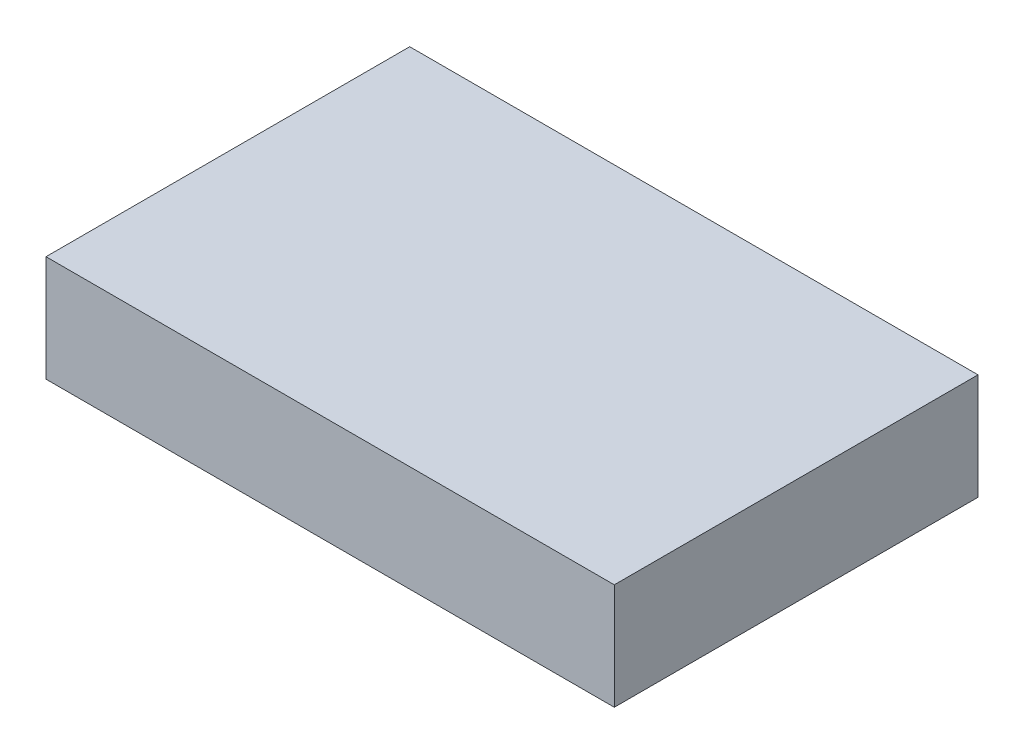
ISO-10303-21;
HEADER;
FILE_DESCRIPTION(('STEP AP214'),'2;1');
FILE_NAME('part.step','',(''),(''),'','','');
FILE_SCHEMA(('AUTOMOTIVE_DESIGN { 1 0 10303 214 1 1 1 1 }'));
ENDSEC;
DATA;
#1=APPLICATION_CONTEXT('core data for automotive mechanical design processes');
#2=APPLICATION_PROTOCOL_DEFINITION('international standard','automotive_design',2000,#1);
#3=PRODUCT_CONTEXT('',#1,'mechanical');
#4=PRODUCT('Part','Part','',(#3));
#5=PRODUCT_RELATED_PRODUCT_CATEGORY('part','',(#4));
#6=PRODUCT_DEFINITION_FORMATION('','',#4);
#7=PRODUCT_DEFINITION_CONTEXT('part definition',#1,'design');
#8=PRODUCT_DEFINITION('design','',#6,#7);
#9=PRODUCT_DEFINITION_SHAPE('','',#8);
#10=(LENGTH_UNIT() NAMED_UNIT(*) SI_UNIT(.MILLI.,.METRE.));
#11=(NAMED_UNIT(*) PLANE_ANGLE_UNIT() SI_UNIT($,.RADIAN.));
#12=(NAMED_UNIT(*) SI_UNIT($,.STERADIAN.) SOLID_ANGLE_UNIT());
#13=UNCERTAINTY_MEASURE_WITH_UNIT(LENGTH_MEASURE(1.E-05),#10,'distance_accuracy_value','');
#14=(GEOMETRIC_REPRESENTATION_CONTEXT(3) GLOBAL_UNCERTAINTY_ASSIGNED_CONTEXT((#13)) GLOBAL_UNIT_ASSIGNED_CONTEXT((#10,
#11,#12)) REPRESENTATION_CONTEXT('',''));
#15=CARTESIAN_POINT('',(0.,0.,0.));
#16=DIRECTION('',(0.,0.,1.));
#17=DIRECTION('',(1.,0.,0.));
#18=AXIS2_PLACEMENT_3D('',#15,#16,#17);
#19=CARTESIAN_POINT('',(37.5,14.,-24.));
#20=DIRECTION('',(-1.,0.,0.));
#21=DIRECTION('',(0.,0.,1.));
#22=AXIS2_PLACEMENT_3D('',#19,#20,#21);
#23=PLANE('',#22);
#24=DIRECTION('',(0.,0.,-1.));
#25=VECTOR('',#24,1.);
#26=CARTESIAN_POINT('',(37.5,0.,-24.));
#27=LINE('',#26,#25);
#28=CARTESIAN_POINT('',(37.5,0.,24.));
#29=VERTEX_POINT('',#28);
#30=CARTESIAN_POINT('',(37.5,0.,-24.));
#31=VERTEX_POINT('',#30);
#32=EDGE_CURVE('E107',#29,#31,#27,.T.);
#33=ORIENTED_EDGE('',*,*,#32,.T.);
#34=DIRECTION('',(0.,-1.,0.));
#35=VECTOR('',#34,1.);
#36=CARTESIAN_POINT('',(37.5,14.,-24.));
#37=LINE('',#36,#35);
#38=CARTESIAN_POINT('',(37.5,14.,-24.));
#39=VERTEX_POINT('',#38);
#40=EDGE_CURVE('E11',#39,#31,#37,.T.);
#41=ORIENTED_EDGE('',*,*,#40,.F.);
#42=DIRECTION('',(0.,0.,-1.));
#43=VECTOR('',#42,1.);
#44=CARTESIAN_POINT('',(37.5,14.,-24.));
#45=LINE('',#44,#43);
#46=CARTESIAN_POINT('',(37.5,14.,24.));
#47=VERTEX_POINT('',#46);
#48=EDGE_CURVE('E91',#47,#39,#45,.T.);
#49=ORIENTED_EDGE('',*,*,#48,.F.);
#50=DIRECTION('',(0.,-1.,0.));
#51=VECTOR('',#50,1.);
#52=CARTESIAN_POINT('',(37.5,14.,24.));
#53=LINE('',#52,#51);
#54=EDGE_CURVE('E103',#47,#29,#53,.T.);
#55=ORIENTED_EDGE('',*,*,#54,.T.);
#56=EDGE_LOOP('',(#33,#41,#49,#55));
#57=FACE_BOUND('',#56,.T.);
#58=ADVANCED_FACE('F39',(#57),#23,.F.);
#59=CARTESIAN_POINT('',(-37.5,14.,-24.));
#60=DIRECTION('',(0.,0.,1.));
#61=DIRECTION('',(1.,0.,0.));
#62=AXIS2_PLACEMENT_3D('',#59,#60,#61);
#63=PLANE('',#62);
#64=DIRECTION('',(-1.,0.,0.));
#65=VECTOR('',#64,1.);
#66=CARTESIAN_POINT('',(-37.5,0.,-24.));
#67=LINE('',#66,#65);
#68=CARTESIAN_POINT('',(-37.5,0.,-24.));
#69=VERTEX_POINT('',#68);
#70=EDGE_CURVE('E96',#31,#69,#67,.T.);
#71=ORIENTED_EDGE('',*,*,#70,.T.);
#72=DIRECTION('',(0.,-1.,0.));
#73=VECTOR('',#72,1.);
#74=CARTESIAN_POINT('',(-37.5,14.,-24.));
#75=LINE('',#74,#73);
#76=CARTESIAN_POINT('',(-37.5,14.,-24.));
#77=VERTEX_POINT('',#76);
#78=EDGE_CURVE('E48',#77,#69,#75,.T.);
#79=ORIENTED_EDGE('',*,*,#78,.F.);
#80=DIRECTION('',(-1.,0.,0.));
#81=VECTOR('',#80,1.);
#82=CARTESIAN_POINT('',(-37.5,14.,-24.));
#83=LINE('',#82,#81);
#84=EDGE_CURVE('E86',#39,#77,#83,.T.);
#85=ORIENTED_EDGE('',*,*,#84,.F.);
#86=ORIENTED_EDGE('',*,*,#40,.T.);
#87=EDGE_LOOP('',(#71,#79,#85,#86));
#88=FACE_BOUND('',#87,.T.);
#89=ADVANCED_FACE('F95',(#88),#63,.F.);
#90=CARTESIAN_POINT('',(-37.5,14.,-24.));
#91=DIRECTION('',(1.,0.,0.));
#92=DIRECTION('',(0.,0.,-1.));
#93=AXIS2_PLACEMENT_3D('',#90,#91,#92);
#94=PLANE('',#93);
#95=DIRECTION('',(0.,0.,1.));
#96=VECTOR('',#95,1.);
#97=CARTESIAN_POINT('',(-37.5,0.,-24.));
#98=LINE('',#97,#96);
#99=CARTESIAN_POINT('',(-37.5,0.,24.));
#100=VERTEX_POINT('',#99);
#101=EDGE_CURVE('E73',#69,#100,#98,.T.);
#102=ORIENTED_EDGE('',*,*,#101,.T.);
#103=DIRECTION('',(0.,-1.,0.));
#104=VECTOR('',#103,1.);
#105=CARTESIAN_POINT('',(-37.5,14.,24.));
#106=LINE('',#105,#104);
#107=CARTESIAN_POINT('',(-37.5,14.,24.));
#108=VERTEX_POINT('',#107);
#109=EDGE_CURVE('E98',#108,#100,#106,.T.);
#110=ORIENTED_EDGE('',*,*,#109,.F.);
#111=DIRECTION('',(0.,0.,1.));
#112=VECTOR('',#111,1.);
#113=CARTESIAN_POINT('',(-37.5,14.,-24.));
#114=LINE('',#113,#112);
#115=EDGE_CURVE('E89',#77,#108,#114,.T.);
#116=ORIENTED_EDGE('',*,*,#115,.F.);
#117=ORIENTED_EDGE('',*,*,#78,.T.);
#118=EDGE_LOOP('',(#102,#110,#116,#117));
#119=FACE_BOUND('',#118,.T.);
#120=ADVANCED_FACE('F99',(#119),#94,.F.);
#121=CARTESIAN_POINT('',(-37.5,14.,24.));
#122=DIRECTION('',(0.,0.,-1.));
#123=DIRECTION('',(-1.,0.,0.));
#124=AXIS2_PLACEMENT_3D('',#121,#122,#123);
#125=PLANE('',#124);
#126=DIRECTION('',(1.,0.,0.));
#127=VECTOR('',#126,1.);
#128=CARTESIAN_POINT('',(-37.5,0.,24.));
#129=LINE('',#128,#127);
#130=EDGE_CURVE('E79',#100,#29,#129,.T.);
#131=ORIENTED_EDGE('',*,*,#130,.T.);
#132=ORIENTED_EDGE('',*,*,#54,.F.);
#133=DIRECTION('',(1.,0.,0.));
#134=VECTOR('',#133,1.);
#135=CARTESIAN_POINT('',(-37.5,14.,24.));
#136=LINE('',#135,#134);
#137=EDGE_CURVE('E56',#108,#47,#136,.T.);
#138=ORIENTED_EDGE('',*,*,#137,.F.);
#139=ORIENTED_EDGE('',*,*,#109,.T.);
#140=EDGE_LOOP('',(#131,#132,#138,#139));
#141=FACE_BOUND('',#140,.T.);
#142=ADVANCED_FACE('F120',(#141),#125,.F.);
#143=CARTESIAN_POINT('',(0.,14.,0.));
#144=DIRECTION('',(0.,1.,0.));
#145=DIRECTION('',(0.,0.,1.));
#146=AXIS2_PLACEMENT_3D('',#143,#144,#145);
#147=PLANE('',#146);
#148=ORIENTED_EDGE('',*,*,#48,.T.);
#149=ORIENTED_EDGE('',*,*,#84,.T.);
#150=ORIENTED_EDGE('',*,*,#115,.T.);
#151=ORIENTED_EDGE('',*,*,#137,.T.);
#152=EDGE_LOOP('',(#148,#149,#150,#151));
#153=FACE_BOUND('',#152,.T.);
#154=ADVANCED_FACE('F87',(#153),#147,.T.);
#155=CARTESIAN_POINT('',(0.,0.,0.));
#156=DIRECTION('',(0.,1.,0.));
#157=DIRECTION('',(0.,0.,1.));
#158=AXIS2_PLACEMENT_3D('',#155,#156,#157);
#159=PLANE('',#158);
#160=ORIENTED_EDGE('',*,*,#32,.F.);
#161=ORIENTED_EDGE('',*,*,#130,.F.);
#162=ORIENTED_EDGE('',*,*,#101,.F.);
#163=ORIENTED_EDGE('',*,*,#70,.F.);
#164=EDGE_LOOP('',(#160,#161,#162,#163));
#165=FACE_BOUND('',#164,.T.);
#166=ADVANCED_FACE('F123',(#165),#159,.F.);
#167=CLOSED_SHELL('',(#58,#89,#120,#142,#154,#166));
#168=MANIFOLD_SOLID_BREP('B2',#167);
#169=ADVANCED_BREP_SHAPE_REPRESENTATION('',(#18,#168),#14);
#170=SHAPE_DEFINITION_REPRESENTATION(#9,#169);
ENDSEC;
END-ISO-10303-21;
